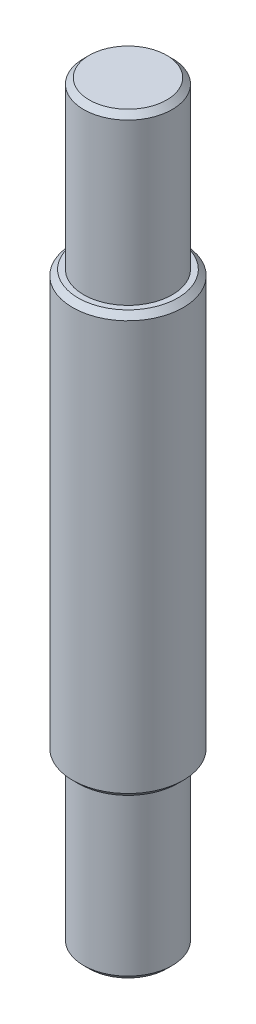
ISO-10303-21;
HEADER;
FILE_DESCRIPTION(('STEP AP214'),'2;1');
FILE_NAME('part.step','',(''),(''),'','','');
FILE_SCHEMA(('AUTOMOTIVE_DESIGN { 1 0 10303 214 1 1 1 1 }'));
ENDSEC;
DATA;
#1=APPLICATION_CONTEXT('core data for automotive mechanical design processes');
#2=APPLICATION_PROTOCOL_DEFINITION('international standard','automotive_design',2000,#1);
#3=PRODUCT_CONTEXT('',#1,'mechanical');
#4=PRODUCT('Part','Part','',(#3));
#5=PRODUCT_RELATED_PRODUCT_CATEGORY('part','',(#4));
#6=PRODUCT_DEFINITION_FORMATION('','',#4);
#7=PRODUCT_DEFINITION_CONTEXT('part definition',#1,'design');
#8=PRODUCT_DEFINITION('design','',#6,#7);
#9=PRODUCT_DEFINITION_SHAPE('','',#8);
#10=(LENGTH_UNIT() NAMED_UNIT(*) SI_UNIT(.MILLI.,.METRE.));
#11=(NAMED_UNIT(*) PLANE_ANGLE_UNIT() SI_UNIT($,.RADIAN.));
#12=(NAMED_UNIT(*) SI_UNIT($,.STERADIAN.) SOLID_ANGLE_UNIT());
#13=UNCERTAINTY_MEASURE_WITH_UNIT(LENGTH_MEASURE(1.E-05),#10,'distance_accuracy_value','');
#14=(GEOMETRIC_REPRESENTATION_CONTEXT(3) GLOBAL_UNCERTAINTY_ASSIGNED_CONTEXT((#13)) GLOBAL_UNIT_ASSIGNED_CONTEXT((#10,
#11,#12)) REPRESENTATION_CONTEXT('',''));
#15=CARTESIAN_POINT('',(0.,0.,0.));
#16=DIRECTION('',(0.,0.,1.));
#17=DIRECTION('',(1.,0.,0.));
#18=AXIS2_PLACEMENT_3D('',#15,#16,#17);
#19=CARTESIAN_POINT('',(0.,19.,0.));
#20=DIRECTION('',(0.,-1.,0.));
#21=DIRECTION('',(0.,0.,-1.));
#22=AXIS2_PLACEMENT_3D('',#19,#20,#21);
#23=CYLINDRICAL_SURFACE('',#22,5.);
#24=CARTESIAN_POINT('',(0.,18.5,0.));
#25=DIRECTION('',(0.,1.,0.));
#26=DIRECTION('',(0.,0.,1.));
#27=AXIS2_PLACEMENT_3D('',#24,#25,#26);
#28=CIRCLE('',#27,5.);
#29=CARTESIAN_POINT('',(0.,18.5,5.));
#30=VERTEX_POINT('',#29);
#31=EDGE_CURVE('E51',#30,#30,#28,.F.);
#32=ORIENTED_EDGE('',*,*,#31,.T.);
#33=EDGE_LOOP('',(#32));
#34=FACE_BOUND('',#33,.T.);
#35=CARTESIAN_POINT('',(0.,-18.5,0.));
#36=DIRECTION('',(0.,1.,0.));
#37=DIRECTION('',(0.,0.,1.));
#38=AXIS2_PLACEMENT_3D('',#35,#36,#37);
#39=CIRCLE('',#38,5.);
#40=CARTESIAN_POINT('',(0.,-18.5,5.));
#41=VERTEX_POINT('',#40);
#42=EDGE_CURVE('E56',#41,#41,#39,.T.);
#43=ORIENTED_EDGE('',*,*,#42,.T.);
#44=EDGE_LOOP('',(#43));
#45=FACE_BOUND('',#44,.T.);
#46=ADVANCED_FACE('F42',(#34,#45),#23,.T.);
#47=CARTESIAN_POINT('',(0.,19.,0.));
#48=DIRECTION('',(0.,1.,0.));
#49=DIRECTION('',(0.,0.,1.));
#50=AXIS2_PLACEMENT_3D('',#47,#48,#49);
#51=PLANE('',#50);
#52=CARTESIAN_POINT('',(0.,19.,0.));
#53=DIRECTION('',(0.,1.,0.));
#54=DIRECTION('',(0.,0.,1.));
#55=AXIS2_PLACEMENT_3D('',#52,#53,#54);
#56=CIRCLE('',#55,4.5);
#57=CARTESIAN_POINT('',(0.,19.,4.5));
#58=VERTEX_POINT('',#57);
#59=EDGE_CURVE('E61',#58,#58,#56,.T.);
#60=ORIENTED_EDGE('',*,*,#59,.T.);
#61=EDGE_LOOP('',(#60));
#62=FACE_BOUND('',#61,.T.);
#63=CARTESIAN_POINT('',(0.,19.,0.));
#64=DIRECTION('',(0.,1.,0.));
#65=DIRECTION('',(0.,0.,1.));
#66=AXIS2_PLACEMENT_3D('',#63,#64,#65);
#67=CIRCLE('',#66,4.);
#68=CARTESIAN_POINT('',(0.,19.,4.));
#69=VERTEX_POINT('',#68);
#70=EDGE_CURVE('E83',#69,#69,#67,.T.);
#71=ORIENTED_EDGE('',*,*,#70,.F.);
#72=EDGE_LOOP('',(#71));
#73=FACE_BOUND('',#72,.T.);
#74=ADVANCED_FACE('F112',(#62,#73),#51,.T.);
#75=CARTESIAN_POINT('',(0.,-19.,0.));
#76=DIRECTION('',(0.,1.,0.));
#77=DIRECTION('',(0.,0.,1.));
#78=AXIS2_PLACEMENT_3D('',#75,#76,#77);
#79=PLANE('',#78);
#80=CARTESIAN_POINT('',(0.,-19.,0.));
#81=DIRECTION('',(0.,1.,0.));
#82=DIRECTION('',(0.,0.,1.));
#83=AXIS2_PLACEMENT_3D('',#80,#81,#82);
#84=CIRCLE('',#83,4.49999999999998);
#85=CARTESIAN_POINT('',(0.,-19.,4.49999999999998));
#86=VERTEX_POINT('',#85);
#87=EDGE_CURVE('E10',#86,#86,#84,.F.);
#88=ORIENTED_EDGE('',*,*,#87,.T.);
#89=EDGE_LOOP('',(#88));
#90=FACE_BOUND('',#89,.T.);
#91=CARTESIAN_POINT('',(0.,-19.,0.));
#92=DIRECTION('',(0.,1.,0.));
#93=DIRECTION('',(0.,0.,1.));
#94=AXIS2_PLACEMENT_3D('',#91,#92,#93);
#95=CIRCLE('',#94,4.);
#96=CARTESIAN_POINT('',(0.,-19.,4.));
#97=VERTEX_POINT('',#96);
#98=EDGE_CURVE('E87',#97,#97,#95,.T.);
#99=ORIENTED_EDGE('',*,*,#98,.T.);
#100=EDGE_LOOP('',(#99));
#101=FACE_BOUND('',#100,.T.);
#102=ADVANCED_FACE('F93',(#90,#101),#79,.F.);
#103=CARTESIAN_POINT('',(0.,34.,0.));
#104=DIRECTION('',(0.,-1.,0.));
#105=DIRECTION('',(0.,0.,-1.));
#106=AXIS2_PLACEMENT_3D('',#103,#104,#105);
#107=CYLINDRICAL_SURFACE('',#106,4.);
#108=CARTESIAN_POINT('',(0.,33.5,0.));
#109=DIRECTION('',(0.,1.,0.));
#110=DIRECTION('',(0.,0.,1.));
#111=AXIS2_PLACEMENT_3D('',#108,#109,#110);
#112=CIRCLE('',#111,4.);
#113=CARTESIAN_POINT('',(0.,33.5,4.));
#114=VERTEX_POINT('',#113);
#115=EDGE_CURVE('E75',#114,#114,#112,.F.);
#116=ORIENTED_EDGE('',*,*,#115,.T.);
#117=EDGE_LOOP('',(#116));
#118=FACE_BOUND('',#117,.T.);
#119=ORIENTED_EDGE('',*,*,#70,.T.);
#120=EDGE_LOOP('',(#119));
#121=FACE_BOUND('',#120,.T.);
#122=ADVANCED_FACE('F108',(#118,#121),#107,.T.);
#123=CARTESIAN_POINT('',(0.,34.,0.));
#124=DIRECTION('',(0.,1.,0.));
#125=DIRECTION('',(0.,0.,1.));
#126=AXIS2_PLACEMENT_3D('',#123,#124,#125);
#127=PLANE('',#126);
#128=CARTESIAN_POINT('',(0.,34.,0.));
#129=DIRECTION('',(0.,1.,0.));
#130=DIRECTION('',(0.,0.,1.));
#131=AXIS2_PLACEMENT_3D('',#128,#129,#130);
#132=CIRCLE('',#131,3.5);
#133=CARTESIAN_POINT('',(0.,34.,3.5));
#134=VERTEX_POINT('',#133);
#135=EDGE_CURVE('E79',#134,#134,#132,.T.);
#136=ORIENTED_EDGE('',*,*,#135,.T.);
#137=EDGE_LOOP('',(#136));
#138=FACE_BOUND('',#137,.T.);
#139=ADVANCED_FACE('F98',(#138),#127,.T.);
#140=CARTESIAN_POINT('',(0.,-34.,0.));
#141=DIRECTION('',(0.,1.,0.));
#142=DIRECTION('',(0.,0.,1.));
#143=AXIS2_PLACEMENT_3D('',#140,#141,#142);
#144=CYLINDRICAL_SURFACE('',#143,4.);
#145=CARTESIAN_POINT('',(0.,-33.5,0.));
#146=DIRECTION('',(0.,1.,0.));
#147=DIRECTION('',(0.,0.,1.));
#148=AXIS2_PLACEMENT_3D('',#145,#146,#147);
#149=CIRCLE('',#148,4.);
#150=CARTESIAN_POINT('',(0.,-33.5,4.));
#151=VERTEX_POINT('',#150);
#152=EDGE_CURVE('E71',#151,#151,#149,.T.);
#153=ORIENTED_EDGE('',*,*,#152,.T.);
#154=EDGE_LOOP('',(#153));
#155=FACE_BOUND('',#154,.T.);
#156=ORIENTED_EDGE('',*,*,#98,.F.);
#157=EDGE_LOOP('',(#156));
#158=FACE_BOUND('',#157,.T.);
#159=ADVANCED_FACE('F95',(#155,#158),#144,.T.);
#160=CARTESIAN_POINT('',(0.,-34.,0.));
#161=DIRECTION('',(0.,1.,0.));
#162=DIRECTION('',(0.,0.,1.));
#163=AXIS2_PLACEMENT_3D('',#160,#161,#162);
#164=PLANE('',#163);
#165=CARTESIAN_POINT('',(0.,-34.,0.));
#166=DIRECTION('',(0.,1.,0.));
#167=DIRECTION('',(0.,0.,1.));
#168=AXIS2_PLACEMENT_3D('',#165,#166,#167);
#169=CIRCLE('',#168,3.50000000000003);
#170=CARTESIAN_POINT('',(0.,-34.,3.50000000000003));
#171=VERTEX_POINT('',#170);
#172=EDGE_CURVE('E67',#171,#171,#169,.F.);
#173=ORIENTED_EDGE('',*,*,#172,.T.);
#174=EDGE_LOOP('',(#173));
#175=FACE_BOUND('',#174,.T.);
#176=ADVANCED_FACE('F97',(#175),#164,.F.);
#177=CARTESIAN_POINT('',(0.,34.,0.));
#178=DIRECTION('',(0.,-1.,0.));
#179=DIRECTION('',(0.,0.,-1.));
#180=AXIS2_PLACEMENT_3D('',#177,#178,#179);
#181=CONICAL_SURFACE('',#180,3.5,0.785398163397445);
#182=ORIENTED_EDGE('',*,*,#115,.F.);
#183=EDGE_LOOP('',(#182));
#184=FACE_BOUND('',#183,.T.);
#185=ORIENTED_EDGE('',*,*,#135,.F.);
#186=EDGE_LOOP('',(#185));
#187=FACE_BOUND('',#186,.T.);
#188=ADVANCED_FACE('F105',(#184,#187),#181,.T.);
#189=CARTESIAN_POINT('',(0.,-33.5,0.));
#190=DIRECTION('',(0.,1.,0.));
#191=DIRECTION('',(0.,0.,1.));
#192=AXIS2_PLACEMENT_3D('',#189,#190,#191);
#193=CONICAL_SURFACE('',#192,4.,0.785398163397445);
#194=ORIENTED_EDGE('',*,*,#172,.F.);
#195=EDGE_LOOP('',(#194));
#196=FACE_BOUND('',#195,.T.);
#197=ORIENTED_EDGE('',*,*,#152,.F.);
#198=EDGE_LOOP('',(#197));
#199=FACE_BOUND('',#198,.T.);
#200=ADVANCED_FACE('F129',(#196,#199),#193,.T.);
#201=CARTESIAN_POINT('',(0.,19.,0.));
#202=DIRECTION('',(0.,-1.,0.));
#203=DIRECTION('',(0.,0.,-1.));
#204=AXIS2_PLACEMENT_3D('',#201,#202,#203);
#205=CONICAL_SURFACE('',#204,4.5,0.785398163397444);
#206=ORIENTED_EDGE('',*,*,#31,.F.);
#207=EDGE_LOOP('',(#206));
#208=FACE_BOUND('',#207,.T.);
#209=ORIENTED_EDGE('',*,*,#59,.F.);
#210=EDGE_LOOP('',(#209));
#211=FACE_BOUND('',#210,.T.);
#212=ADVANCED_FACE('F135',(#208,#211),#205,.T.);
#213=CARTESIAN_POINT('',(0.,-18.5,0.));
#214=DIRECTION('',(0.,1.,0.));
#215=DIRECTION('',(0.,0.,1.));
#216=AXIS2_PLACEMENT_3D('',#213,#214,#215);
#217=CONICAL_SURFACE('',#216,5.,0.785398163397458);
#218=ORIENTED_EDGE('',*,*,#87,.F.);
#219=EDGE_LOOP('',(#218));
#220=FACE_BOUND('',#219,.T.);
#221=ORIENTED_EDGE('',*,*,#42,.F.);
#222=EDGE_LOOP('',(#221));
#223=FACE_BOUND('',#222,.T.);
#224=ADVANCED_FACE('F45',(#220,#223),#217,.T.);
#225=CLOSED_SHELL('',(#46,#74,#102,#122,#139,#159,#176,#188,#200,#212,#224));
#226=MANIFOLD_SOLID_BREP('B2',#225);
#227=ADVANCED_BREP_SHAPE_REPRESENTATION('',(#18,#226),#14);
#228=SHAPE_DEFINITION_REPRESENTATION(#9,#227);
ENDSEC;
END-ISO-10303-21;
